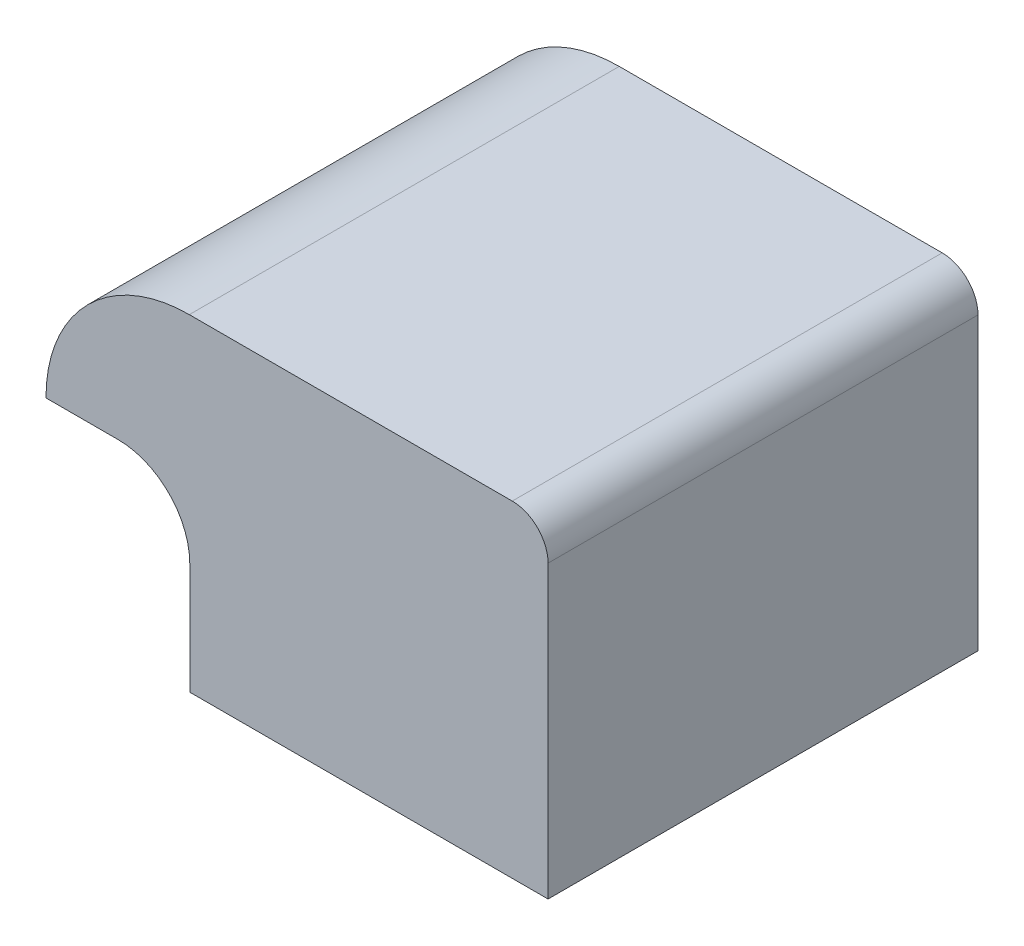
ISO-10303-21;
HEADER;
FILE_DESCRIPTION(('STEP AP214'),'2;1');
FILE_NAME('part.step','',(''),(''),'','','');
FILE_SCHEMA(('AUTOMOTIVE_DESIGN { 1 0 10303 214 1 1 1 1 }'));
ENDSEC;
DATA;
#1=APPLICATION_CONTEXT('core data for automotive mechanical design processes');
#2=APPLICATION_PROTOCOL_DEFINITION('international standard','automotive_design',2000,#1);
#3=PRODUCT_CONTEXT('',#1,'mechanical');
#4=PRODUCT('Part','Part','',(#3));
#5=PRODUCT_RELATED_PRODUCT_CATEGORY('part','',(#4));
#6=PRODUCT_DEFINITION_FORMATION('','',#4);
#7=PRODUCT_DEFINITION_CONTEXT('part definition',#1,'design');
#8=PRODUCT_DEFINITION('design','',#6,#7);
#9=PRODUCT_DEFINITION_SHAPE('','',#8);
#10=(LENGTH_UNIT() NAMED_UNIT(*) SI_UNIT(.MILLI.,.METRE.));
#11=(NAMED_UNIT(*) PLANE_ANGLE_UNIT() SI_UNIT($,.RADIAN.));
#12=(NAMED_UNIT(*) SI_UNIT($,.STERADIAN.) SOLID_ANGLE_UNIT());
#13=UNCERTAINTY_MEASURE_WITH_UNIT(LENGTH_MEASURE(1.E-05),#10,'distance_accuracy_value','');
#14=(GEOMETRIC_REPRESENTATION_CONTEXT(3) GLOBAL_UNCERTAINTY_ASSIGNED_CONTEXT((#13)) GLOBAL_UNIT_ASSIGNED_CONTEXT((#10,
#11,#12)) REPRESENTATION_CONTEXT('',''));
#15=CARTESIAN_POINT('',(0.,0.,0.));
#16=DIRECTION('',(0.,0.,1.));
#17=DIRECTION('',(1.,0.,0.));
#18=AXIS2_PLACEMENT_3D('',#15,#16,#17);
#19=CARTESIAN_POINT('',(-48.7134003663004,0.,6.));
#20=DIRECTION('',(1.,0.,0.));
#21=DIRECTION('',(0.,0.,-1.));
#22=AXIS2_PLACEMENT_3D('',#19,#20,#21);
#23=PLANE('',#22);
#24=DIRECTION('',(0.,-1.,0.));
#25=VECTOR('',#24,1.);
#26=CARTESIAN_POINT('',(-48.7134003663004,0.,6.));
#27=LINE('',#26,#25);
#28=CARTESIAN_POINT('',(-48.7134003663004,-2.,6.));
#29=VERTEX_POINT('',#28);
#30=CARTESIAN_POINT('',(-48.7134003663004,-2.00721405617799,6.));
#31=VERTEX_POINT('',#30);
#32=EDGE_CURVE('E103',#29,#31,#27,.T.);
#33=ORIENTED_EDGE('',*,*,#32,.F.);
#34=DIRECTION('',(0.,0.,-1.));
#35=VECTOR('',#34,1.);
#36=CARTESIAN_POINT('',(-48.7134003663004,-2.,6.));
#37=LINE('',#36,#35);
#38=CARTESIAN_POINT('',(-48.7134003663004,-2.,0.));
#39=VERTEX_POINT('',#38);
#40=EDGE_CURVE('E139',#29,#39,#37,.T.);
#41=ORIENTED_EDGE('',*,*,#40,.T.);
#42=DIRECTION('',(0.,-1.,0.));
#43=VECTOR('',#42,1.);
#44=CARTESIAN_POINT('',(-48.7134003663004,0.,0.));
#45=LINE('',#44,#43);
#46=CARTESIAN_POINT('',(-48.7134003663004,-2.00721405617799,0.));
#47=VERTEX_POINT('',#46);
#48=EDGE_CURVE('E122',#39,#47,#45,.T.);
#49=ORIENTED_EDGE('',*,*,#48,.T.);
#50=DIRECTION('',(0.,0.,-1.));
#51=VECTOR('',#50,1.);
#52=CARTESIAN_POINT('',(-48.7134003663004,-2.00721405617799,6.));
#53=LINE('',#52,#51);
#54=EDGE_CURVE('E118',#31,#47,#53,.T.);
#55=ORIENTED_EDGE('',*,*,#54,.F.);
#56=EDGE_LOOP('',(#33,#41,#49,#55));
#57=FACE_BOUND('',#56,.T.);
#58=ADVANCED_FACE('F33',(#57),#23,.F.);
#59=CARTESIAN_POINT('',(-48.7134003663004,-2.00721405617799,6.));
#60=DIRECTION('',(0.,1.,0.));
#61=DIRECTION('',(0.,0.,1.));
#62=AXIS2_PLACEMENT_3D('',#59,#60,#61);
#63=PLANE('',#62);
#64=DIRECTION('',(1.,0.,0.));
#65=VECTOR('',#64,1.);
#66=CARTESIAN_POINT('',(-48.7134003663004,-2.00721405617799,0.));
#67=LINE('',#66,#65);
#68=CARTESIAN_POINT('',(-47.7066018500759,-2.00721405617799,0.));
#69=VERTEX_POINT('',#68);
#70=EDGE_CURVE('E160',#47,#69,#67,.T.);
#71=ORIENTED_EDGE('',*,*,#70,.T.);
#72=DIRECTION('',(0.,0.,-1.));
#73=VECTOR('',#72,1.);
#74=CARTESIAN_POINT('',(-47.7066018500759,-2.00721405617799,6.));
#75=LINE('',#74,#73);
#76=CARTESIAN_POINT('',(-47.7066018500759,-2.00721405617799,6.));
#77=VERTEX_POINT('',#76);
#78=EDGE_CURVE('E48',#69,#77,#75,.F.);
#79=ORIENTED_EDGE('',*,*,#78,.T.);
#80=DIRECTION('',(1.,0.,0.));
#81=VECTOR('',#80,1.);
#82=CARTESIAN_POINT('',(-48.7134003663004,-2.00721405617799,6.));
#83=LINE('',#82,#81);
#84=EDGE_CURVE('E106',#31,#77,#83,.T.);
#85=ORIENTED_EDGE('',*,*,#84,.F.);
#86=ORIENTED_EDGE('',*,*,#54,.T.);
#87=EDGE_LOOP('',(#71,#79,#85,#86));
#88=FACE_BOUND('',#87,.T.);
#89=ADVANCED_FACE('F117',(#88),#63,.F.);
#90=CARTESIAN_POINT('',(-46.7066018500759,-2.00721405617799,6.));
#91=DIRECTION('',(1.,0.,0.));
#92=DIRECTION('',(0.,0.,-1.));
#93=AXIS2_PLACEMENT_3D('',#90,#91,#92);
#94=PLANE('',#93);
#95=DIRECTION('',(0.,-1.,0.));
#96=VECTOR('',#95,1.);
#97=CARTESIAN_POINT('',(-46.7066018500759,-2.00721405617799,6.));
#98=LINE('',#97,#96);
#99=CARTESIAN_POINT('',(-46.7066018500759,-3.00721405617799,6.));
#100=VERTEX_POINT('',#99);
#101=CARTESIAN_POINT('',(-46.7066018500759,-4.56,6.));
#102=VERTEX_POINT('',#101);
#103=EDGE_CURVE('E119',#100,#102,#98,.T.);
#104=ORIENTED_EDGE('',*,*,#103,.F.);
#105=DIRECTION('',(0.,0.,-1.));
#106=VECTOR('',#105,1.);
#107=CARTESIAN_POINT('',(-46.7066018500759,-3.00721405617799,0.));
#108=LINE('',#107,#106);
#109=CARTESIAN_POINT('',(-46.7066018500759,-3.00721405617799,0.));
#110=VERTEX_POINT('',#109);
#111=EDGE_CURVE('E146',#100,#110,#108,.T.);
#112=ORIENTED_EDGE('',*,*,#111,.T.);
#113=DIRECTION('',(0.,-1.,0.));
#114=VECTOR('',#113,1.);
#115=CARTESIAN_POINT('',(-46.7066018500759,-2.00721405617799,0.));
#116=LINE('',#115,#114);
#117=CARTESIAN_POINT('',(-46.7066018500759,-4.56,0.));
#118=VERTEX_POINT('',#117);
#119=EDGE_CURVE('E154',#110,#118,#116,.T.);
#120=ORIENTED_EDGE('',*,*,#119,.T.);
#121=DIRECTION('',(0.,0.,-1.));
#122=VECTOR('',#121,1.);
#123=CARTESIAN_POINT('',(-46.7066018500759,-4.56,6.));
#124=LINE('',#123,#122);
#125=EDGE_CURVE('E124',#102,#118,#124,.T.);
#126=ORIENTED_EDGE('',*,*,#125,.F.);
#127=EDGE_LOOP('',(#104,#112,#120,#126));
#128=FACE_BOUND('',#127,.T.);
#129=ADVANCED_FACE('F152',(#128),#94,.F.);
#130=CARTESIAN_POINT('',(-46.7066018500759,-4.56,6.));
#131=DIRECTION('',(0.,1.,0.));
#132=DIRECTION('',(0.,0.,1.));
#133=AXIS2_PLACEMENT_3D('',#130,#131,#132);
#134=PLANE('',#133);
#135=DIRECTION('',(1.,0.,0.));
#136=VECTOR('',#135,1.);
#137=CARTESIAN_POINT('',(-46.7066018500759,-4.56,0.));
#138=LINE('',#137,#136);
#139=CARTESIAN_POINT('',(-41.7066018500759,-4.56,0.));
#140=VERTEX_POINT('',#139);
#141=EDGE_CURVE('E159',#118,#140,#138,.T.);
#142=ORIENTED_EDGE('',*,*,#141,.T.);
#143=DIRECTION('',(0.,0.,-1.));
#144=VECTOR('',#143,1.);
#145=CARTESIAN_POINT('',(-41.7066018500759,-4.56,6.));
#146=LINE('',#145,#144);
#147=CARTESIAN_POINT('',(-41.7066018500759,-4.56,6.));
#148=VERTEX_POINT('',#147);
#149=EDGE_CURVE('E130',#148,#140,#146,.T.);
#150=ORIENTED_EDGE('',*,*,#149,.F.);
#151=DIRECTION('',(1.,0.,0.));
#152=VECTOR('',#151,1.);
#153=CARTESIAN_POINT('',(-46.7066018500759,-4.56,6.));
#154=LINE('',#153,#152);
#155=EDGE_CURVE('E179',#102,#148,#154,.T.);
#156=ORIENTED_EDGE('',*,*,#155,.F.);
#157=ORIENTED_EDGE('',*,*,#125,.T.);
#158=EDGE_LOOP('',(#142,#150,#156,#157));
#159=FACE_BOUND('',#158,.T.);
#160=ADVANCED_FACE('F185',(#159),#134,.F.);
#161=CARTESIAN_POINT('',(-41.7066018500759,0.,6.));
#162=DIRECTION('',(-1.,0.,0.));
#163=DIRECTION('',(0.,0.,1.));
#164=AXIS2_PLACEMENT_3D('',#161,#162,#163);
#165=PLANE('',#164);
#166=DIRECTION('',(0.,1.,0.));
#167=VECTOR('',#166,1.);
#168=CARTESIAN_POINT('',(-41.7066018500759,0.,0.));
#169=LINE('',#168,#167);
#170=CARTESIAN_POINT('',(-41.7066018500759,-0.5,0.));
#171=VERTEX_POINT('',#170);
#172=EDGE_CURVE('E162',#140,#171,#169,.T.);
#173=ORIENTED_EDGE('',*,*,#172,.T.);
#174=DIRECTION('',(0.,0.,-1.));
#175=VECTOR('',#174,1.);
#176=CARTESIAN_POINT('',(-41.7066018500759,-0.5,6.));
#177=LINE('',#176,#175);
#178=CARTESIAN_POINT('',(-41.7066018500759,-0.5,6.));
#179=VERTEX_POINT('',#178);
#180=EDGE_CURVE('E135',#171,#179,#177,.F.);
#181=ORIENTED_EDGE('',*,*,#180,.T.);
#182=DIRECTION('',(0.,1.,0.));
#183=VECTOR('',#182,1.);
#184=CARTESIAN_POINT('',(-41.7066018500759,0.,6.));
#185=LINE('',#184,#183);
#186=EDGE_CURVE('E175',#148,#179,#185,.T.);
#187=ORIENTED_EDGE('',*,*,#186,.F.);
#188=ORIENTED_EDGE('',*,*,#149,.T.);
#189=EDGE_LOOP('',(#173,#181,#187,#188));
#190=FACE_BOUND('',#189,.T.);
#191=ADVANCED_FACE('F186',(#190),#165,.F.);
#192=CARTESIAN_POINT('',(-48.7134003663004,0.,6.));
#193=DIRECTION('',(0.,-1.,0.));
#194=DIRECTION('',(0.,0.,-1.));
#195=AXIS2_PLACEMENT_3D('',#192,#193,#194);
#196=PLANE('',#195);
#197=DIRECTION('',(-1.,0.,0.));
#198=VECTOR('',#197,1.);
#199=CARTESIAN_POINT('',(-48.7134003663004,0.,0.));
#200=LINE('',#199,#198);
#201=CARTESIAN_POINT('',(-42.2066018500759,0.,0.));
#202=VERTEX_POINT('',#201);
#203=CARTESIAN_POINT('',(-46.7134003663004,0.,0.));
#204=VERTEX_POINT('',#203);
#205=EDGE_CURVE('E114',#202,#204,#200,.T.);
#206=ORIENTED_EDGE('',*,*,#205,.T.);
#207=DIRECTION('',(0.,0.,-1.));
#208=VECTOR('',#207,1.);
#209=CARTESIAN_POINT('',(-46.7134003663004,0.,6.));
#210=LINE('',#209,#208);
#211=CARTESIAN_POINT('',(-46.7134003663004,0.,6.));
#212=VERTEX_POINT('',#211);
#213=EDGE_CURVE('E143',#204,#212,#210,.F.);
#214=ORIENTED_EDGE('',*,*,#213,.T.);
#215=DIRECTION('',(-1.,0.,0.));
#216=VECTOR('',#215,1.);
#217=CARTESIAN_POINT('',(-48.7134003663004,0.,6.));
#218=LINE('',#217,#216);
#219=CARTESIAN_POINT('',(-42.2066018500759,0.,6.));
#220=VERTEX_POINT('',#219);
#221=EDGE_CURVE('E171',#220,#212,#218,.T.);
#222=ORIENTED_EDGE('',*,*,#221,.F.);
#223=DIRECTION('',(0.,0.,-1.));
#224=VECTOR('',#223,1.);
#225=CARTESIAN_POINT('',(-42.2066018500759,0.,6.));
#226=LINE('',#225,#224);
#227=EDGE_CURVE('E123',#220,#202,#226,.T.);
#228=ORIENTED_EDGE('',*,*,#227,.T.);
#229=EDGE_LOOP('',(#206,#214,#222,#228));
#230=FACE_BOUND('',#229,.T.);
#231=ADVANCED_FACE('F194',(#230),#196,.F.);
#232=CARTESIAN_POINT('',(0.,0.,6.));
#233=DIRECTION('',(0.,0.,1.));
#234=DIRECTION('',(1.,0.,0.));
#235=AXIS2_PLACEMENT_3D('',#232,#233,#234);
#236=PLANE('',#235);
#237=ORIENTED_EDGE('',*,*,#221,.T.);
#238=CARTESIAN_POINT('',(-46.7134003663004,-2.,6.));
#239=DIRECTION('',(0.,0.,1.));
#240=DIRECTION('',(1.,0.,0.));
#241=AXIS2_PLACEMENT_3D('',#238,#239,#240);
#242=CIRCLE('',#241,2.);
#243=EDGE_CURVE('E109',#212,#29,#242,.T.);
#244=ORIENTED_EDGE('',*,*,#243,.T.);
#245=ORIENTED_EDGE('',*,*,#32,.T.);
#246=ORIENTED_EDGE('',*,*,#84,.T.);
#247=CARTESIAN_POINT('',(-47.7066018500759,-3.00721405617799,6.));
#248=DIRECTION('',(0.,0.,1.));
#249=DIRECTION('',(1.,0.,0.));
#250=AXIS2_PLACEMENT_3D('',#247,#248,#249);
#251=CIRCLE('',#250,1.);
#252=EDGE_CURVE('E11',#77,#100,#251,.F.);
#253=ORIENTED_EDGE('',*,*,#252,.T.);
#254=ORIENTED_EDGE('',*,*,#103,.T.);
#255=ORIENTED_EDGE('',*,*,#155,.T.);
#256=ORIENTED_EDGE('',*,*,#186,.T.);
#257=CARTESIAN_POINT('',(-42.2066018500759,-0.5,6.));
#258=DIRECTION('',(0.,0.,1.));
#259=DIRECTION('',(1.,0.,0.));
#260=AXIS2_PLACEMENT_3D('',#257,#258,#259);
#261=CIRCLE('',#260,0.5);
#262=EDGE_CURVE('E137',#179,#220,#261,.T.);
#263=ORIENTED_EDGE('',*,*,#262,.T.);
#264=EDGE_LOOP('',(#237,#244,#245,#246,#253,#254,#255,#256,#263));
#265=FACE_BOUND('',#264,.T.);
#266=ADVANCED_FACE('F105',(#265),#236,.T.);
#267=CARTESIAN_POINT('',(0.,0.,0.));
#268=DIRECTION('',(0.,0.,1.));
#269=DIRECTION('',(1.,0.,0.));
#270=AXIS2_PLACEMENT_3D('',#267,#268,#269);
#271=PLANE('',#270);
#272=ORIENTED_EDGE('',*,*,#48,.F.);
#273=CARTESIAN_POINT('',(-46.7134003663004,-2.,0.));
#274=DIRECTION('',(0.,0.,1.));
#275=DIRECTION('',(1.,0.,0.));
#276=AXIS2_PLACEMENT_3D('',#273,#274,#275);
#277=CIRCLE('',#276,2.);
#278=EDGE_CURVE('E141',#39,#204,#277,.F.);
#279=ORIENTED_EDGE('',*,*,#278,.T.);
#280=ORIENTED_EDGE('',*,*,#205,.F.);
#281=CARTESIAN_POINT('',(-42.2066018500759,-0.5,0.));
#282=DIRECTION('',(0.,0.,1.));
#283=DIRECTION('',(1.,0.,0.));
#284=AXIS2_PLACEMENT_3D('',#281,#282,#283);
#285=CIRCLE('',#284,0.5);
#286=EDGE_CURVE('E127',#202,#171,#285,.F.);
#287=ORIENTED_EDGE('',*,*,#286,.T.);
#288=ORIENTED_EDGE('',*,*,#172,.F.);
#289=ORIENTED_EDGE('',*,*,#141,.F.);
#290=ORIENTED_EDGE('',*,*,#119,.F.);
#291=CARTESIAN_POINT('',(-47.7066018500759,-3.00721405617799,0.));
#292=DIRECTION('',(0.,0.,1.));
#293=DIRECTION('',(1.,0.,0.));
#294=AXIS2_PLACEMENT_3D('',#291,#292,#293);
#295=CIRCLE('',#294,1.);
#296=EDGE_CURVE('E41',#110,#69,#295,.T.);
#297=ORIENTED_EDGE('',*,*,#296,.T.);
#298=ORIENTED_EDGE('',*,*,#70,.F.);
#299=EDGE_LOOP('',(#272,#279,#280,#287,#288,#289,#290,#297,#298));
#300=FACE_BOUND('',#299,.T.);
#301=ADVANCED_FACE('F157',(#300),#271,.F.);
#302=CARTESIAN_POINT('',(-42.2066018500759,-0.5,6.));
#303=DIRECTION('',(0.,0.,-1.));
#304=DIRECTION('',(-1.,0.,0.));
#305=AXIS2_PLACEMENT_3D('',#302,#303,#304);
#306=CYLINDRICAL_SURFACE('',#305,0.5);
#307=ORIENTED_EDGE('',*,*,#262,.F.);
#308=ORIENTED_EDGE('',*,*,#180,.F.);
#309=ORIENTED_EDGE('',*,*,#286,.F.);
#310=ORIENTED_EDGE('',*,*,#227,.F.);
#311=EDGE_LOOP('',(#307,#308,#309,#310));
#312=FACE_BOUND('',#311,.T.);
#313=ADVANCED_FACE('F191',(#312),#306,.T.);
#314=CARTESIAN_POINT('',(-46.7134003663004,-2.,6.));
#315=DIRECTION('',(0.,0.,-1.));
#316=DIRECTION('',(-1.,0.,0.));
#317=AXIS2_PLACEMENT_3D('',#314,#315,#316);
#318=CYLINDRICAL_SURFACE('',#317,2.);
#319=ORIENTED_EDGE('',*,*,#243,.F.);
#320=ORIENTED_EDGE('',*,*,#213,.F.);
#321=ORIENTED_EDGE('',*,*,#278,.F.);
#322=ORIENTED_EDGE('',*,*,#40,.F.);
#323=EDGE_LOOP('',(#319,#320,#321,#322));
#324=FACE_BOUND('',#323,.T.);
#325=ADVANCED_FACE('F197',(#324),#318,.T.);
#326=CARTESIAN_POINT('',(-47.7066018500759,-3.00721405617799,6.));
#327=DIRECTION('',(0.,0.,1.));
#328=DIRECTION('',(1.,0.,0.));
#329=AXIS2_PLACEMENT_3D('',#326,#327,#328);
#330=CYLINDRICAL_SURFACE('',#329,1.);
#331=ORIENTED_EDGE('',*,*,#252,.F.);
#332=ORIENTED_EDGE('',*,*,#78,.F.);
#333=ORIENTED_EDGE('',*,*,#296,.F.);
#334=ORIENTED_EDGE('',*,*,#111,.F.);
#335=EDGE_LOOP('',(#331,#332,#333,#334));
#336=FACE_BOUND('',#335,.T.);
#337=ADVANCED_FACE('F35',(#336),#330,.F.);
#338=CLOSED_SHELL('',(#58,#89,#129,#160,#191,#231,#266,#301,#313,#325,#337));
#339=MANIFOLD_SOLID_BREP('B2',#338);
#340=ADVANCED_BREP_SHAPE_REPRESENTATION('',(#18,#339),#14);
#341=SHAPE_DEFINITION_REPRESENTATION(#9,#340);
ENDSEC;
END-ISO-10303-21;
